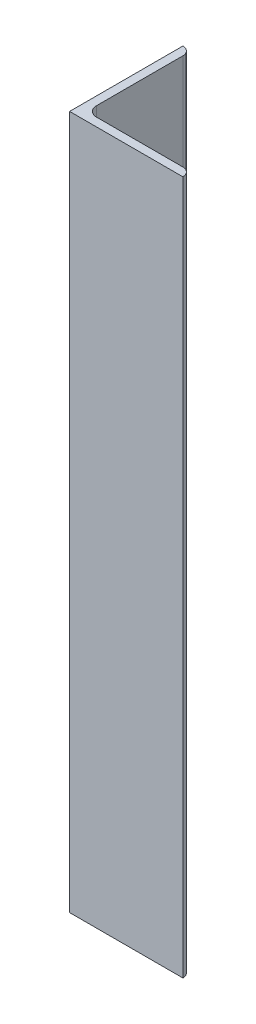
ISO-10303-21;
HEADER;
FILE_DESCRIPTION(('STEP AP214'),'2;1');
FILE_NAME('part.step','',(''),(''),'','','');
FILE_SCHEMA(('AUTOMOTIVE_DESIGN { 1 0 10303 214 1 1 1 1 }'));
ENDSEC;
DATA;
#1=APPLICATION_CONTEXT('core data for automotive mechanical design processes');
#2=APPLICATION_PROTOCOL_DEFINITION('international standard','automotive_design',2000,#1);
#3=PRODUCT_CONTEXT('',#1,'mechanical');
#4=PRODUCT('Part','Part','',(#3));
#5=PRODUCT_RELATED_PRODUCT_CATEGORY('part','',(#4));
#6=PRODUCT_DEFINITION_FORMATION('','',#4);
#7=PRODUCT_DEFINITION_CONTEXT('part definition',#1,'design');
#8=PRODUCT_DEFINITION('design','',#6,#7);
#9=PRODUCT_DEFINITION_SHAPE('','',#8);
#10=(LENGTH_UNIT() NAMED_UNIT(*) SI_UNIT(.MILLI.,.METRE.));
#11=(NAMED_UNIT(*) PLANE_ANGLE_UNIT() SI_UNIT($,.RADIAN.));
#12=(NAMED_UNIT(*) SI_UNIT($,.STERADIAN.) SOLID_ANGLE_UNIT());
#13=UNCERTAINTY_MEASURE_WITH_UNIT(LENGTH_MEASURE(1.E-05),#10,'distance_accuracy_value','');
#14=(GEOMETRIC_REPRESENTATION_CONTEXT(3) GLOBAL_UNCERTAINTY_ASSIGNED_CONTEXT((#13)) GLOBAL_UNIT_ASSIGNED_CONTEXT((#10,
#11,#12)) REPRESENTATION_CONTEXT('',''));
#15=CARTESIAN_POINT('',(0.,0.,0.));
#16=DIRECTION('',(0.,0.,1.));
#17=DIRECTION('',(1.,0.,0.));
#18=AXIS2_PLACEMENT_3D('',#15,#16,#17);
#19=CARTESIAN_POINT('',(40.,245.,0.));
#20=DIRECTION('',(0.,0.,-1.));
#21=DIRECTION('',(-1.,0.,0.));
#22=AXIS2_PLACEMENT_3D('',#19,#20,#21);
#23=PLANE('',#22);
#24=DIRECTION('',(1.,0.,0.));
#25=VECTOR('',#24,1.);
#26=CARTESIAN_POINT('',(40.,0.,0.));
#27=LINE('',#26,#25);
#28=CARTESIAN_POINT('',(0.,0.,0.));
#29=VERTEX_POINT('',#28);
#30=CARTESIAN_POINT('',(40.,0.,0.));
#31=VERTEX_POINT('',#30);
#32=EDGE_CURVE('E160',#29,#31,#27,.T.);
#33=ORIENTED_EDGE('',*,*,#32,.T.);
#34=DIRECTION('',(0.,-1.,0.));
#35=VECTOR('',#34,1.);
#36=CARTESIAN_POINT('',(40.,245.,0.));
#37=LINE('',#36,#35);
#38=CARTESIAN_POINT('',(40.,245.,0.));
#39=VERTEX_POINT('',#38);
#40=EDGE_CURVE('E13',#39,#31,#37,.T.);
#41=ORIENTED_EDGE('',*,*,#40,.F.);
#42=DIRECTION('',(1.,0.,0.));
#43=VECTOR('',#42,1.);
#44=CARTESIAN_POINT('',(40.,245.,0.));
#45=LINE('',#44,#43);
#46=CARTESIAN_POINT('',(0.,245.,0.));
#47=VERTEX_POINT('',#46);
#48=EDGE_CURVE('E179',#47,#39,#45,.T.);
#49=ORIENTED_EDGE('',*,*,#48,.F.);
#50=DIRECTION('',(0.,-1.,0.));
#51=VECTOR('',#50,1.);
#52=CARTESIAN_POINT('',(0.,245.,0.));
#53=LINE('',#52,#51);
#54=EDGE_CURVE('E156',#47,#29,#53,.T.);
#55=ORIENTED_EDGE('',*,*,#54,.T.);
#56=EDGE_LOOP('',(#33,#41,#49,#55));
#57=FACE_BOUND('',#56,.T.);
#58=ADVANCED_FACE('F65',(#57),#23,.F.);
#59=CARTESIAN_POINT('',(37.,245.,0.));
#60=DIRECTION('',(0.,-1.,0.));
#61=DIRECTION('',(0.,0.,-1.));
#62=AXIS2_PLACEMENT_3D('',#59,#60,#61);
#63=CYLINDRICAL_SURFACE('',#62,3.00000000000001);
#64=CARTESIAN_POINT('',(37.,0.,0.));
#65=DIRECTION('',(0.,1.,0.));
#66=DIRECTION('',(0.,0.,1.));
#67=AXIS2_PLACEMENT_3D('',#64,#65,#66);
#68=CIRCLE('',#67,3.00000000000001);
#69=CARTESIAN_POINT('',(37.,0.,-3.));
#70=VERTEX_POINT('',#69);
#71=EDGE_CURVE('E164',#31,#70,#68,.T.);
#72=ORIENTED_EDGE('',*,*,#71,.T.);
#73=DIRECTION('',(0.,-1.,0.));
#74=VECTOR('',#73,1.);
#75=CARTESIAN_POINT('',(37.,245.,-3.));
#76=LINE('',#75,#74);
#77=CARTESIAN_POINT('',(37.,245.,-3.));
#78=VERTEX_POINT('',#77);
#79=EDGE_CURVE('E74',#78,#70,#76,.T.);
#80=ORIENTED_EDGE('',*,*,#79,.F.);
#81=CARTESIAN_POINT('',(37.,245.,0.));
#82=DIRECTION('',(0.,1.,0.));
#83=DIRECTION('',(0.,0.,1.));
#84=AXIS2_PLACEMENT_3D('',#81,#82,#83);
#85=CIRCLE('',#84,3.00000000000001);
#86=EDGE_CURVE('E122',#39,#78,#85,.T.);
#87=ORIENTED_EDGE('',*,*,#86,.F.);
#88=ORIENTED_EDGE('',*,*,#40,.T.);
#89=EDGE_LOOP('',(#72,#80,#87,#88));
#90=FACE_BOUND('',#89,.T.);
#91=ADVANCED_FACE('F213',(#90),#63,.T.);
#92=CARTESIAN_POINT('',(6.5,245.,-3.));
#93=DIRECTION('',(0.,0.,1.));
#94=DIRECTION('',(1.,0.,0.));
#95=AXIS2_PLACEMENT_3D('',#92,#93,#94);
#96=PLANE('',#95);
#97=DIRECTION('',(-1.,0.,0.));
#98=VECTOR('',#97,1.);
#99=CARTESIAN_POINT('',(6.5,0.,-3.));
#100=LINE('',#99,#98);
#101=CARTESIAN_POINT('',(6.5,0.,-3.));
#102=VERTEX_POINT('',#101);
#103=EDGE_CURVE('E167',#70,#102,#100,.T.);
#104=ORIENTED_EDGE('',*,*,#103,.T.);
#105=DIRECTION('',(0.,-1.,0.));
#106=VECTOR('',#105,1.);
#107=CARTESIAN_POINT('',(6.5,245.,-3.));
#108=LINE('',#107,#106);
#109=CARTESIAN_POINT('',(6.5,245.,-3.));
#110=VERTEX_POINT('',#109);
#111=EDGE_CURVE('E186',#110,#102,#108,.T.);
#112=ORIENTED_EDGE('',*,*,#111,.F.);
#113=DIRECTION('',(-1.,0.,0.));
#114=VECTOR('',#113,1.);
#115=CARTESIAN_POINT('',(6.5,245.,-3.));
#116=LINE('',#115,#114);
#117=EDGE_CURVE('E196',#78,#110,#116,.T.);
#118=ORIENTED_EDGE('',*,*,#117,.F.);
#119=ORIENTED_EDGE('',*,*,#79,.T.);
#120=EDGE_LOOP('',(#104,#112,#118,#119));
#121=FACE_BOUND('',#120,.T.);
#122=ADVANCED_FACE('F194',(#121),#96,.F.);
#123=CARTESIAN_POINT('',(6.5,245.,-6.5));
#124=DIRECTION('',(0.,-1.,0.));
#125=DIRECTION('',(0.,0.,-1.));
#126=AXIS2_PLACEMENT_3D('',#123,#124,#125);
#127=CYLINDRICAL_SURFACE('',#126,3.5);
#128=CARTESIAN_POINT('',(6.5,0.,-6.5));
#129=DIRECTION('',(0.,-1.,0.));
#130=DIRECTION('',(0.,0.,-1.));
#131=AXIS2_PLACEMENT_3D('',#128,#129,#130);
#132=CIRCLE('',#131,3.5);
#133=CARTESIAN_POINT('',(3.,0.,-6.5));
#134=VERTEX_POINT('',#133);
#135=EDGE_CURVE('E170',#102,#134,#132,.T.);
#136=ORIENTED_EDGE('',*,*,#135,.T.);
#137=DIRECTION('',(0.,-1.,0.));
#138=VECTOR('',#137,1.);
#139=CARTESIAN_POINT('',(3.,245.,-6.5));
#140=LINE('',#139,#138);
#141=CARTESIAN_POINT('',(3.,245.,-6.5));
#142=VERTEX_POINT('',#141);
#143=EDGE_CURVE('E149',#142,#134,#140,.T.);
#144=ORIENTED_EDGE('',*,*,#143,.F.);
#145=CARTESIAN_POINT('',(6.5,245.,-6.5));
#146=DIRECTION('',(0.,-1.,0.));
#147=DIRECTION('',(0.,0.,-1.));
#148=AXIS2_PLACEMENT_3D('',#145,#146,#147);
#149=CIRCLE('',#148,3.5);
#150=EDGE_CURVE('E138',#110,#142,#149,.T.);
#151=ORIENTED_EDGE('',*,*,#150,.F.);
#152=ORIENTED_EDGE('',*,*,#111,.T.);
#153=EDGE_LOOP('',(#136,#144,#151,#152));
#154=FACE_BOUND('',#153,.T.);
#155=ADVANCED_FACE('F202',(#154),#127,.F.);
#156=CARTESIAN_POINT('',(3.,245.,-37.));
#157=DIRECTION('',(-1.,0.,0.));
#158=DIRECTION('',(0.,0.,1.));
#159=AXIS2_PLACEMENT_3D('',#156,#157,#158);
#160=PLANE('',#159);
#161=DIRECTION('',(0.,0.,-1.));
#162=VECTOR('',#161,1.);
#163=CARTESIAN_POINT('',(3.,0.,-37.));
#164=LINE('',#163,#162);
#165=CARTESIAN_POINT('',(3.,0.,-37.));
#166=VERTEX_POINT('',#165);
#167=EDGE_CURVE('E147',#134,#166,#164,.T.);
#168=ORIENTED_EDGE('',*,*,#167,.T.);
#169=DIRECTION('',(0.,-1.,0.));
#170=VECTOR('',#169,1.);
#171=CARTESIAN_POINT('',(3.,245.,-37.));
#172=LINE('',#171,#170);
#173=CARTESIAN_POINT('',(3.,245.,-37.));
#174=VERTEX_POINT('',#173);
#175=EDGE_CURVE('E144',#174,#166,#172,.T.);
#176=ORIENTED_EDGE('',*,*,#175,.F.);
#177=DIRECTION('',(0.,0.,-1.));
#178=VECTOR('',#177,1.);
#179=CARTESIAN_POINT('',(3.,245.,-37.));
#180=LINE('',#179,#178);
#181=EDGE_CURVE('E132',#142,#174,#180,.T.);
#182=ORIENTED_EDGE('',*,*,#181,.F.);
#183=ORIENTED_EDGE('',*,*,#143,.T.);
#184=EDGE_LOOP('',(#168,#176,#182,#183));
#185=FACE_BOUND('',#184,.T.);
#186=ADVANCED_FACE('F145',(#185),#160,.F.);
#187=CARTESIAN_POINT('',(0.,245.,-37.));
#188=DIRECTION('',(0.,-1.,0.));
#189=DIRECTION('',(0.,0.,-1.));
#190=AXIS2_PLACEMENT_3D('',#187,#188,#189);
#191=CYLINDRICAL_SURFACE('',#190,3.);
#192=CARTESIAN_POINT('',(0.,0.,-37.));
#193=DIRECTION('',(0.,1.,0.));
#194=DIRECTION('',(0.,0.,-1.));
#195=AXIS2_PLACEMENT_3D('',#192,#193,#194);
#196=CIRCLE('',#195,3.);
#197=CARTESIAN_POINT('',(0.,0.,-40.));
#198=VERTEX_POINT('',#197);
#199=EDGE_CURVE('E108',#166,#198,#196,.T.);
#200=ORIENTED_EDGE('',*,*,#199,.T.);
#201=DIRECTION('',(0.,-1.,0.));
#202=VECTOR('',#201,1.);
#203=CARTESIAN_POINT('',(0.,245.,-40.));
#204=LINE('',#203,#202);
#205=CARTESIAN_POINT('',(0.,245.,-40.));
#206=VERTEX_POINT('',#205);
#207=EDGE_CURVE('E150',#206,#198,#204,.T.);
#208=ORIENTED_EDGE('',*,*,#207,.F.);
#209=CARTESIAN_POINT('',(0.,245.,-37.));
#210=DIRECTION('',(0.,1.,0.));
#211=DIRECTION('',(0.,0.,-1.));
#212=AXIS2_PLACEMENT_3D('',#209,#210,#211);
#213=CIRCLE('',#212,3.);
#214=EDGE_CURVE('E136',#174,#206,#213,.T.);
#215=ORIENTED_EDGE('',*,*,#214,.F.);
#216=ORIENTED_EDGE('',*,*,#175,.T.);
#217=EDGE_LOOP('',(#200,#208,#215,#216));
#218=FACE_BOUND('',#217,.T.);
#219=ADVANCED_FACE('F152',(#218),#191,.T.);
#220=CARTESIAN_POINT('',(0.,245.,0.));
#221=DIRECTION('',(1.,0.,0.));
#222=DIRECTION('',(0.,0.,-1.));
#223=AXIS2_PLACEMENT_3D('',#220,#221,#222);
#224=PLANE('',#223);
#225=DIRECTION('',(0.,0.,1.));
#226=VECTOR('',#225,1.);
#227=CARTESIAN_POINT('',(0.,0.,0.));
#228=LINE('',#227,#226);
#229=EDGE_CURVE('E114',#198,#29,#228,.T.);
#230=ORIENTED_EDGE('',*,*,#229,.T.);
#231=ORIENTED_EDGE('',*,*,#54,.F.);
#232=DIRECTION('',(0.,0.,1.));
#233=VECTOR('',#232,1.);
#234=CARTESIAN_POINT('',(0.,245.,0.));
#235=LINE('',#234,#233);
#236=EDGE_CURVE('E82',#206,#47,#235,.T.);
#237=ORIENTED_EDGE('',*,*,#236,.F.);
#238=ORIENTED_EDGE('',*,*,#207,.T.);
#239=EDGE_LOOP('',(#230,#231,#237,#238));
#240=FACE_BOUND('',#239,.T.);
#241=ADVANCED_FACE('F227',(#240),#224,.F.);
#242=CARTESIAN_POINT('',(0.,245.,-37.));
#243=DIRECTION('',(0.,-1.,0.));
#244=DIRECTION('',(0.,0.,-1.));
#245=AXIS2_PLACEMENT_3D('',#242,#243,#244);
#246=PLANE('',#245);
#247=ORIENTED_EDGE('',*,*,#48,.T.);
#248=ORIENTED_EDGE('',*,*,#86,.T.);
#249=ORIENTED_EDGE('',*,*,#117,.T.);
#250=ORIENTED_EDGE('',*,*,#150,.T.);
#251=ORIENTED_EDGE('',*,*,#181,.T.);
#252=ORIENTED_EDGE('',*,*,#214,.T.);
#253=ORIENTED_EDGE('',*,*,#236,.T.);
#254=EDGE_LOOP('',(#247,#248,#249,#250,#251,#252,#253));
#255=FACE_BOUND('',#254,.T.);
#256=ADVANCED_FACE('F134',(#255),#246,.F.);
#257=CARTESIAN_POINT('',(0.,0.,-37.));
#258=DIRECTION('',(0.,-1.,0.));
#259=DIRECTION('',(0.,0.,-1.));
#260=AXIS2_PLACEMENT_3D('',#257,#258,#259);
#261=PLANE('',#260);
#262=ORIENTED_EDGE('',*,*,#32,.F.);
#263=ORIENTED_EDGE('',*,*,#229,.F.);
#264=ORIENTED_EDGE('',*,*,#199,.F.);
#265=ORIENTED_EDGE('',*,*,#167,.F.);
#266=ORIENTED_EDGE('',*,*,#135,.F.);
#267=ORIENTED_EDGE('',*,*,#103,.F.);
#268=ORIENTED_EDGE('',*,*,#71,.F.);
#269=EDGE_LOOP('',(#262,#263,#264,#265,#266,#267,#268));
#270=FACE_BOUND('',#269,.T.);
#271=ADVANCED_FACE('F200',(#270),#261,.T.);
#272=CLOSED_SHELL('',(#58,#91,#122,#155,#186,#219,#241,#256,#271));
#273=MANIFOLD_SOLID_BREP('B2',#272);
#274=ADVANCED_BREP_SHAPE_REPRESENTATION('',(#18,#273),#14);
#275=SHAPE_DEFINITION_REPRESENTATION(#9,#274);
ENDSEC;
END-ISO-10303-21;
